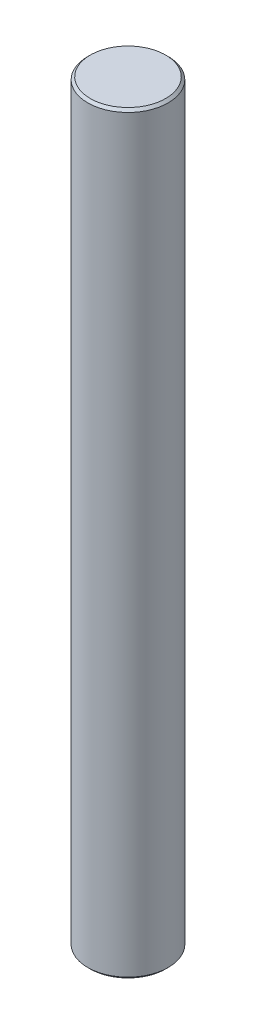
ISO-10303-21;
HEADER;
FILE_DESCRIPTION(('STEP AP214'),'2;1');
FILE_NAME('part.step','',(''),(''),'','','');
FILE_SCHEMA(('AUTOMOTIVE_DESIGN { 1 0 10303 214 1 1 1 1 }'));
ENDSEC;
DATA;
#1=APPLICATION_CONTEXT('core data for automotive mechanical design processes');
#2=APPLICATION_PROTOCOL_DEFINITION('international standard','automotive_design',2000,#1);
#3=PRODUCT_CONTEXT('',#1,'mechanical');
#4=PRODUCT('Part','Part','',(#3));
#5=PRODUCT_RELATED_PRODUCT_CATEGORY('part','',(#4));
#6=PRODUCT_DEFINITION_FORMATION('','',#4);
#7=PRODUCT_DEFINITION_CONTEXT('part definition',#1,'design');
#8=PRODUCT_DEFINITION('design','',#6,#7);
#9=PRODUCT_DEFINITION_SHAPE('','',#8);
#10=(LENGTH_UNIT() NAMED_UNIT(*) SI_UNIT(.MILLI.,.METRE.));
#11=(NAMED_UNIT(*) PLANE_ANGLE_UNIT() SI_UNIT($,.RADIAN.));
#12=(NAMED_UNIT(*) SI_UNIT($,.STERADIAN.) SOLID_ANGLE_UNIT());
#13=UNCERTAINTY_MEASURE_WITH_UNIT(LENGTH_MEASURE(1.E-05),#10,'distance_accuracy_value','');
#14=(GEOMETRIC_REPRESENTATION_CONTEXT(3) GLOBAL_UNCERTAINTY_ASSIGNED_CONTEXT((#13)) GLOBAL_UNIT_ASSIGNED_CONTEXT((#10,
#11,#12)) REPRESENTATION_CONTEXT('',''));
#15=CARTESIAN_POINT('',(0.,0.,0.));
#16=DIRECTION('',(0.,0.,1.));
#17=DIRECTION('',(1.,0.,0.));
#18=AXIS2_PLACEMENT_3D('',#15,#16,#17);
#19=CARTESIAN_POINT('',(0.,75.,0.));
#20=DIRECTION('',(0.,-1.,0.));
#21=DIRECTION('',(0.,0.,-1.));
#22=AXIS2_PLACEMENT_3D('',#19,#20,#21);
#23=CYLINDRICAL_SURFACE('',#22,4.);
#24=CARTESIAN_POINT('',(0.,0.25,0.));
#25=DIRECTION('',(0.,1.,0.));
#26=DIRECTION('',(0.,0.,1.));
#27=AXIS2_PLACEMENT_3D('',#24,#25,#26);
#28=CIRCLE('',#27,4.);
#29=CARTESIAN_POINT('',(0.,0.25,4.));
#30=VERTEX_POINT('',#29);
#31=EDGE_CURVE('E45',#30,#30,#28,.T.);
#32=ORIENTED_EDGE('',*,*,#31,.T.);
#33=EDGE_LOOP('',(#32));
#34=FACE_BOUND('',#33,.T.);
#35=CARTESIAN_POINT('',(0.,74.75,0.));
#36=DIRECTION('',(0.,1.,0.));
#37=DIRECTION('',(0.,0.,1.));
#38=AXIS2_PLACEMENT_3D('',#35,#36,#37);
#39=CIRCLE('',#38,4.);
#40=CARTESIAN_POINT('',(0.,74.75,4.));
#41=VERTEX_POINT('',#40);
#42=EDGE_CURVE('E49',#41,#41,#39,.F.);
#43=ORIENTED_EDGE('',*,*,#42,.T.);
#44=EDGE_LOOP('',(#43));
#45=FACE_BOUND('',#44,.T.);
#46=ADVANCED_FACE('F33',(#34,#45),#23,.T.);
#47=CARTESIAN_POINT('',(0.,75.,0.));
#48=DIRECTION('',(0.,1.,0.));
#49=DIRECTION('',(0.,0.,1.));
#50=AXIS2_PLACEMENT_3D('',#47,#48,#49);
#51=PLANE('',#50);
#52=CARTESIAN_POINT('',(0.,75.,0.));
#53=DIRECTION('',(0.,1.,0.));
#54=DIRECTION('',(0.,0.,1.));
#55=AXIS2_PLACEMENT_3D('',#52,#53,#54);
#56=CIRCLE('',#55,3.75000000000001);
#57=CARTESIAN_POINT('',(0.,75.,3.75000000000001));
#58=VERTEX_POINT('',#57);
#59=EDGE_CURVE('E10',#58,#58,#56,.T.);
#60=ORIENTED_EDGE('',*,*,#59,.T.);
#61=EDGE_LOOP('',(#60));
#62=FACE_BOUND('',#61,.T.);
#63=ADVANCED_FACE('F65',(#62),#51,.T.);
#64=CARTESIAN_POINT('',(0.,0.,0.));
#65=DIRECTION('',(0.,1.,0.));
#66=DIRECTION('',(0.,0.,1.));
#67=AXIS2_PLACEMENT_3D('',#64,#65,#66);
#68=PLANE('',#67);
#69=CARTESIAN_POINT('',(0.,0.,0.));
#70=DIRECTION('',(0.,1.,0.));
#71=DIRECTION('',(0.,0.,1.));
#72=AXIS2_PLACEMENT_3D('',#69,#70,#71);
#73=CIRCLE('',#72,3.75);
#74=CARTESIAN_POINT('',(0.,0.,3.75));
#75=VERTEX_POINT('',#74);
#76=EDGE_CURVE('E41',#75,#75,#73,.F.);
#77=ORIENTED_EDGE('',*,*,#76,.T.);
#78=EDGE_LOOP('',(#77));
#79=FACE_BOUND('',#78,.T.);
#80=ADVANCED_FACE('F62',(#79),#68,.F.);
#81=CARTESIAN_POINT('',(0.,0.25,0.));
#82=DIRECTION('',(0.,1.,0.));
#83=DIRECTION('',(0.,0.,1.));
#84=AXIS2_PLACEMENT_3D('',#81,#82,#83);
#85=CONICAL_SURFACE('',#84,4.,0.785398163397455);
#86=ORIENTED_EDGE('',*,*,#76,.F.);
#87=EDGE_LOOP('',(#86));
#88=FACE_BOUND('',#87,.T.);
#89=ORIENTED_EDGE('',*,*,#31,.F.);
#90=EDGE_LOOP('',(#89));
#91=FACE_BOUND('',#90,.T.);
#92=ADVANCED_FACE('F58',(#88,#91),#85,.T.);
#93=CARTESIAN_POINT('',(0.,75.,0.));
#94=DIRECTION('',(0.,-1.,0.));
#95=DIRECTION('',(0.,0.,-1.));
#96=AXIS2_PLACEMENT_3D('',#93,#94,#95);
#97=CONICAL_SURFACE('',#96,3.75000000000001,0.785398163397428);
#98=ORIENTED_EDGE('',*,*,#42,.F.);
#99=EDGE_LOOP('',(#98));
#100=FACE_BOUND('',#99,.T.);
#101=ORIENTED_EDGE('',*,*,#59,.F.);
#102=EDGE_LOOP('',(#101));
#103=FACE_BOUND('',#102,.T.);
#104=ADVANCED_FACE('F36',(#100,#103),#97,.T.);
#105=CLOSED_SHELL('',(#46,#63,#80,#92,#104));
#106=MANIFOLD_SOLID_BREP('B2',#105);
#107=ADVANCED_BREP_SHAPE_REPRESENTATION('',(#18,#106),#14);
#108=SHAPE_DEFINITION_REPRESENTATION(#9,#107);
ENDSEC;
END-ISO-10303-21;
